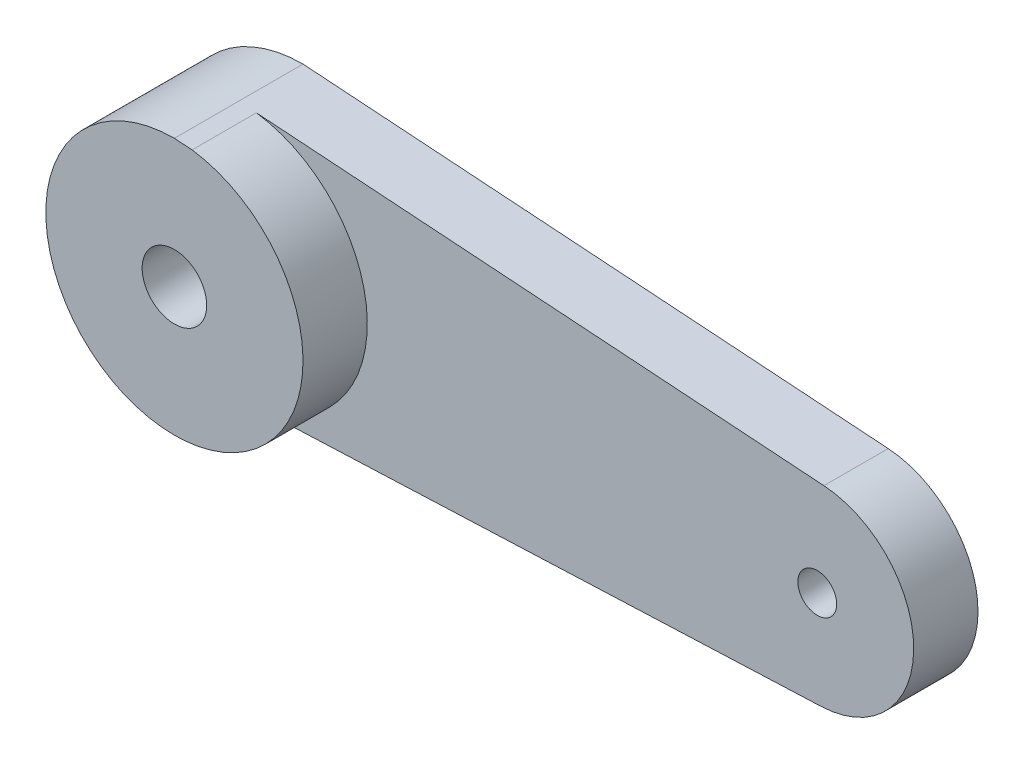
ISO-10303-21;
HEADER;
FILE_DESCRIPTION(('STEP AP214'),'2;1');
FILE_NAME('part.step','',(''),(''),'','','');
FILE_SCHEMA(('AUTOMOTIVE_DESIGN { 1 0 10303 214 1 1 1 1 }'));
ENDSEC;
DATA;
#1=APPLICATION_CONTEXT('core data for automotive mechanical design processes');
#2=APPLICATION_PROTOCOL_DEFINITION('international standard','automotive_design',2000,#1);
#3=PRODUCT_CONTEXT('',#1,'mechanical');
#4=PRODUCT('Part','Part','',(#3));
#5=PRODUCT_RELATED_PRODUCT_CATEGORY('part','',(#4));
#6=PRODUCT_DEFINITION_FORMATION('','',#4);
#7=PRODUCT_DEFINITION_CONTEXT('part definition',#1,'design');
#8=PRODUCT_DEFINITION('design','',#6,#7);
#9=PRODUCT_DEFINITION_SHAPE('','',#8);
#10=(LENGTH_UNIT() NAMED_UNIT(*) SI_UNIT(.MILLI.,.METRE.));
#11=(NAMED_UNIT(*) PLANE_ANGLE_UNIT() SI_UNIT($,.RADIAN.));
#12=(NAMED_UNIT(*) SI_UNIT($,.STERADIAN.) SOLID_ANGLE_UNIT());
#13=UNCERTAINTY_MEASURE_WITH_UNIT(LENGTH_MEASURE(1.E-05),#10,'distance_accuracy_value','');
#14=(GEOMETRIC_REPRESENTATION_CONTEXT(3) GLOBAL_UNCERTAINTY_ASSIGNED_CONTEXT((#13)) GLOBAL_UNIT_ASSIGNED_CONTEXT((#10,
#11,#12)) REPRESENTATION_CONTEXT('',''));
#15=CARTESIAN_POINT('',(0.,0.,0.));
#16=DIRECTION('',(0.,0.,1.));
#17=DIRECTION('',(1.,0.,0.));
#18=AXIS2_PLACEMENT_3D('',#15,#16,#17);
#19=CARTESIAN_POINT('',(0.686952853013244,9.95258475724918,10.));
#20=DIRECTION('',(0.0688587269348014,0.997626420923643,0.));
#21=DIRECTION('',(-0.997626420923643,0.0688587269348014,0.));
#22=AXIS2_PLACEMENT_3D('',#19,#20,#21);
#23=PLANE('',#22);
#24=DIRECTION('',(0.997626420923644,-0.0688587269348014,0.));
#25=VECTOR('',#24,1.);
#26=CARTESIAN_POINT('',(0.686952853013244,9.95258475724918,0.));
#27=LINE('',#26,#25);
#28=CARTESIAN_POINT('',(0.,10.,0.));
#29=VERTEX_POINT('',#28);
#30=CARTESIAN_POINT('',(45.5121199289753,6.85863708830833,0.));
#31=VERTEX_POINT('',#30);
#32=EDGE_CURVE('E113',#29,#31,#27,.T.);
#33=ORIENTED_EDGE('',*,*,#32,.F.);
#34=DIRECTION('',(0.,0.,-1.));
#35=VECTOR('',#34,1.);
#36=CARTESIAN_POINT('',(0.,10.,10.));
#37=LINE('',#36,#35);
#38=CARTESIAN_POINT('',(0.,10.,10.));
#39=VERTEX_POINT('',#38);
#40=EDGE_CURVE('E11',#39,#29,#37,.T.);
#41=ORIENTED_EDGE('',*,*,#40,.F.);
#42=DIRECTION('',(0.997626420923644,-0.0688587269348014,0.));
#43=VECTOR('',#42,1.);
#44=CARTESIAN_POINT('',(0.686952853013244,9.95258475724918,10.));
#45=LINE('',#44,#43);
#46=CARTESIAN_POINT('',(1.37390570602649,9.90516951449837,10.));
#47=VERTEX_POINT('',#46);
#48=EDGE_CURVE('E122',#39,#47,#45,.T.);
#49=ORIENTED_EDGE('',*,*,#48,.T.);
#50=DIRECTION('',(0.,0.,-1.));
#51=VECTOR('',#50,1.);
#52=CARTESIAN_POINT('',(1.37390570602649,9.90516951449837,10.));
#53=LINE('',#52,#51);
#54=CARTESIAN_POINT('',(1.37390570602649,9.90516951449837,5.));
#55=VERTEX_POINT('',#54);
#56=EDGE_CURVE('E137',#47,#55,#53,.T.);
#57=ORIENTED_EDGE('',*,*,#56,.T.);
#58=DIRECTION('',(0.997626420923644,-0.0688587269348014,0.));
#59=VECTOR('',#58,1.);
#60=CARTESIAN_POINT('',(0.686952853013244,9.95258475724918,5.));
#61=LINE('',#60,#59);
#62=CARTESIAN_POINT('',(45.5121199289753,6.85863708830833,5.));
#63=VERTEX_POINT('',#62);
#64=EDGE_CURVE('E98',#55,#63,#61,.T.);
#65=ORIENTED_EDGE('',*,*,#64,.T.);
#66=DIRECTION('',(0.,0.,-1.));
#67=VECTOR('',#66,1.);
#68=CARTESIAN_POINT('',(45.5121199289753,6.85863708830833,5.));
#69=LINE('',#68,#67);
#70=EDGE_CURVE('E94',#63,#31,#69,.T.);
#71=ORIENTED_EDGE('',*,*,#70,.T.);
#72=EDGE_LOOP('',(#33,#41,#49,#57,#65,#71));
#73=FACE_BOUND('',#72,.T.);
#74=ADVANCED_FACE('F35',(#73),#23,.T.);
#75=CARTESIAN_POINT('',(0.,0.,10.));
#76=DIRECTION('',(0.,0.,-1.));
#77=DIRECTION('',(-1.,0.,0.));
#78=AXIS2_PLACEMENT_3D('',#75,#76,#77);
#79=CYLINDRICAL_SURFACE('',#78,10.);
#80=CARTESIAN_POINT('',(0.,0.,0.));
#81=DIRECTION('',(0.,0.,1.));
#82=DIRECTION('',(1.,0.,0.));
#83=AXIS2_PLACEMENT_3D('',#80,#81,#82);
#84=CIRCLE('',#83,10.);
#85=CARTESIAN_POINT('',(0.,-10.,0.));
#86=VERTEX_POINT('',#85);
#87=EDGE_CURVE('E133',#29,#86,#84,.T.);
#88=ORIENTED_EDGE('',*,*,#87,.T.);
#89=DIRECTION('',(0.,0.,-1.));
#90=VECTOR('',#89,1.);
#91=CARTESIAN_POINT('',(0.,-10.,10.));
#92=LINE('',#91,#90);
#93=CARTESIAN_POINT('',(0.,-10.,10.));
#94=VERTEX_POINT('',#93);
#95=EDGE_CURVE('E43',#94,#86,#92,.T.);
#96=ORIENTED_EDGE('',*,*,#95,.F.);
#97=CARTESIAN_POINT('',(0.,0.,10.));
#98=DIRECTION('',(0.,0.,1.));
#99=DIRECTION('',(1.,0.,0.));
#100=AXIS2_PLACEMENT_3D('',#97,#98,#99);
#101=CIRCLE('',#100,10.);
#102=EDGE_CURVE('E125',#39,#94,#101,.T.);
#103=ORIENTED_EDGE('',*,*,#102,.F.);
#104=ORIENTED_EDGE('',*,*,#40,.T.);
#105=EDGE_LOOP('',(#88,#96,#103,#104));
#106=FACE_BOUND('',#105,.T.);
#107=ADVANCED_FACE('F143',(#106),#79,.T.);
#108=CARTESIAN_POINT('',(0.414871138524848,-9.98275846679519,10.));
#109=DIRECTION('',(-0.041522925239939,0.999137551430992,0.));
#110=DIRECTION('',(-0.999137551430992,-0.041522925239939,0.));
#111=AXIS2_PLACEMENT_3D('',#108,#109,#110);
#112=PLANE('',#111);
#113=DIRECTION('',(0.999137551430992,0.041522925239939,0.));
#114=VECTOR('',#113,1.);
#115=CARTESIAN_POINT('',(0.414871138524848,-9.98275846679519,0.));
#116=LINE('',#115,#114);
#117=CARTESIAN_POINT('',(45.3071014162638,-8.11709270435144,0.));
#118=VERTEX_POINT('',#117);
#119=EDGE_CURVE('E108',#86,#118,#116,.T.);
#120=ORIENTED_EDGE('',*,*,#119,.T.);
#121=DIRECTION('',(0.,0.,-1.));
#122=VECTOR('',#121,1.);
#123=CARTESIAN_POINT('',(45.3071014162638,-8.11709270435144,5.));
#124=LINE('',#123,#122);
#125=CARTESIAN_POINT('',(45.3071014162638,-8.11709270435144,5.));
#126=VERTEX_POINT('',#125);
#127=EDGE_CURVE('E92',#126,#118,#124,.T.);
#128=ORIENTED_EDGE('',*,*,#127,.F.);
#129=DIRECTION('',(0.999137551430992,0.041522925239939,0.));
#130=VECTOR('',#129,1.);
#131=CARTESIAN_POINT('',(0.414871138524848,-9.98275846679519,5.));
#132=LINE('',#131,#130);
#133=CARTESIAN_POINT('',(0.829742277049664,-9.96551693359037,5.));
#134=VERTEX_POINT('',#133);
#135=EDGE_CURVE('E99',#134,#126,#132,.T.);
#136=ORIENTED_EDGE('',*,*,#135,.F.);
#137=DIRECTION('',(0.,0.,-1.));
#138=VECTOR('',#137,1.);
#139=CARTESIAN_POINT('',(0.829742277049664,-9.96551693359037,10.));
#140=LINE('',#139,#138);
#141=CARTESIAN_POINT('',(0.829742277049664,-9.96551693359037,10.));
#142=VERTEX_POINT('',#141);
#143=EDGE_CURVE('E50',#142,#134,#140,.T.);
#144=ORIENTED_EDGE('',*,*,#143,.F.);
#145=DIRECTION('',(0.999137551430992,0.041522925239939,0.));
#146=VECTOR('',#145,1.);
#147=CARTESIAN_POINT('',(0.414871138524848,-9.98275846679519,10.));
#148=LINE('',#147,#146);
#149=EDGE_CURVE('E128',#94,#142,#148,.T.);
#150=ORIENTED_EDGE('',*,*,#149,.F.);
#151=ORIENTED_EDGE('',*,*,#95,.T.);
#152=EDGE_LOOP('',(#120,#128,#136,#144,#150,#151));
#153=FACE_BOUND('',#152,.T.);
#154=ADVANCED_FACE('F106',(#153),#112,.F.);
#155=CARTESIAN_POINT('',(0.,0.,10.));
#156=DIRECTION('',(0.,0.,-1.));
#157=DIRECTION('',(-1.,0.,0.));
#158=AXIS2_PLACEMENT_3D('',#155,#156,#157);
#159=CYLINDRICAL_SURFACE('',#158,2.51);
#160=CARTESIAN_POINT('',(0.,0.,10.));
#161=DIRECTION('',(0.,0.,1.));
#162=DIRECTION('',(1.,0.,0.));
#163=AXIS2_PLACEMENT_3D('',#160,#161,#162);
#164=CIRCLE('',#163,2.51);
#165=CARTESIAN_POINT('',(2.51,0.,10.));
#166=VERTEX_POINT('',#165);
#167=EDGE_CURVE('E119',#166,#166,#164,.T.);
#168=ORIENTED_EDGE('',*,*,#167,.T.);
#169=EDGE_LOOP('',(#168));
#170=FACE_BOUND('',#169,.T.);
#171=CARTESIAN_POINT('',(0.,0.,0.));
#172=DIRECTION('',(0.,0.,1.));
#173=DIRECTION('',(1.,0.,0.));
#174=AXIS2_PLACEMENT_3D('',#171,#172,#173);
#175=CIRCLE('',#174,2.51);
#176=CARTESIAN_POINT('',(2.51,0.,0.));
#177=VERTEX_POINT('',#176);
#178=EDGE_CURVE('E110',#177,#177,#175,.T.);
#179=ORIENTED_EDGE('',*,*,#178,.F.);
#180=EDGE_LOOP('',(#179));
#181=FACE_BOUND('',#180,.T.);
#182=ADVANCED_FACE('F37',(#170,#181),#159,.F.);
#183=ORIENTED_EDGE('',*,*,#143,.T.);
#184=CARTESIAN_POINT('',(0.,0.,5.));
#185=DIRECTION('',(0.,0.,1.));
#186=DIRECTION('',(1.,0.,0.));
#187=AXIS2_PLACEMENT_3D('',#184,#185,#186);
#188=CIRCLE('',#187,10.);
#189=EDGE_CURVE('E55',#134,#55,#188,.T.);
#190=ORIENTED_EDGE('',*,*,#189,.T.);
#191=ORIENTED_EDGE('',*,*,#56,.F.);
#192=EDGE_CURVE('E129',#142,#47,#101,.T.);
#193=ORIENTED_EDGE('',*,*,#192,.F.);
#194=EDGE_LOOP('',(#183,#190,#191,#193));
#195=FACE_BOUND('',#194,.T.);
#196=ADVANCED_FACE('F171',(#195),#79,.T.);
#197=CARTESIAN_POINT('',(0.,0.,10.));
#198=DIRECTION('',(0.,0.,1.));
#199=DIRECTION('',(1.,0.,0.));
#200=AXIS2_PLACEMENT_3D('',#197,#198,#199);
#201=PLANE('',#200);
#202=ORIENTED_EDGE('',*,*,#167,.F.);
#203=EDGE_LOOP('',(#202));
#204=FACE_BOUND('',#203,.T.);
#205=ORIENTED_EDGE('',*,*,#48,.F.);
#206=ORIENTED_EDGE('',*,*,#102,.T.);
#207=ORIENTED_EDGE('',*,*,#149,.T.);
#208=ORIENTED_EDGE('',*,*,#192,.T.);
#209=EDGE_LOOP('',(#205,#206,#207,#208));
#210=FACE_BOUND('',#209,.T.);
#211=ADVANCED_FACE('F176',(#204,#210),#201,.T.);
#212=CARTESIAN_POINT('',(0.,0.,0.));
#213=DIRECTION('',(0.,0.,1.));
#214=DIRECTION('',(1.,0.,0.));
#215=AXIS2_PLACEMENT_3D('',#212,#213,#214);
#216=PLANE('',#215);
#217=ORIENTED_EDGE('',*,*,#178,.T.);
#218=EDGE_LOOP('',(#217));
#219=FACE_BOUND('',#218,.T.);
#220=ORIENTED_EDGE('',*,*,#32,.T.);
#221=CARTESIAN_POINT('',(44.9956794769643,-0.623561068618998,0.));
#222=DIRECTION('',(0.,0.,1.));
#223=DIRECTION('',(1.,0.,0.));
#224=AXIS2_PLACEMENT_3D('',#221,#222,#223);
#225=CIRCLE('',#224,7.5);
#226=EDGE_CURVE('E149',#118,#31,#225,.T.);
#227=ORIENTED_EDGE('',*,*,#226,.F.);
#228=ORIENTED_EDGE('',*,*,#119,.F.);
#229=ORIENTED_EDGE('',*,*,#87,.F.);
#230=EDGE_LOOP('',(#220,#227,#228,#229));
#231=FACE_BOUND('',#230,.T.);
#232=CARTESIAN_POINT('',(44.9956794769643,-0.623561068618998,0.));
#233=DIRECTION('',(0.,0.,1.));
#234=DIRECTION('',(1.,0.,0.));
#235=AXIS2_PLACEMENT_3D('',#232,#233,#234);
#236=CIRCLE('',#235,1.51);
#237=CARTESIAN_POINT('',(46.5056794769643,-0.623561068618998,0.));
#238=VERTEX_POINT('',#237);
#239=EDGE_CURVE('E104',#238,#238,#236,.T.);
#240=ORIENTED_EDGE('',*,*,#239,.T.);
#241=EDGE_LOOP('',(#240));
#242=FACE_BOUND('',#241,.T.);
#243=ADVANCED_FACE('F146',(#219,#231,#242),#216,.F.);
#244=CARTESIAN_POINT('',(44.9956794769643,-0.623561068618998,5.));
#245=DIRECTION('',(0.,0.,-1.));
#246=DIRECTION('',(-1.,0.,0.));
#247=AXIS2_PLACEMENT_3D('',#244,#245,#246);
#248=CYLINDRICAL_SURFACE('',#247,7.5);
#249=ORIENTED_EDGE('',*,*,#226,.T.);
#250=ORIENTED_EDGE('',*,*,#70,.F.);
#251=CARTESIAN_POINT('',(44.9956794769643,-0.623561068618998,5.));
#252=DIRECTION('',(0.,0.,1.));
#253=DIRECTION('',(1.,0.,0.));
#254=AXIS2_PLACEMENT_3D('',#251,#252,#253);
#255=CIRCLE('',#254,7.5);
#256=EDGE_CURVE('E87',#126,#63,#255,.T.);
#257=ORIENTED_EDGE('',*,*,#256,.F.);
#258=ORIENTED_EDGE('',*,*,#127,.T.);
#259=EDGE_LOOP('',(#249,#250,#257,#258));
#260=FACE_BOUND('',#259,.T.);
#261=ADVANCED_FACE('F90',(#260),#248,.T.);
#262=CARTESIAN_POINT('',(44.9956794769643,-0.623561068618998,5.));
#263=DIRECTION('',(0.,0.,-1.));
#264=DIRECTION('',(-1.,0.,0.));
#265=AXIS2_PLACEMENT_3D('',#262,#263,#264);
#266=CYLINDRICAL_SURFACE('',#265,1.51);
#267=CARTESIAN_POINT('',(44.9956794769643,-0.623561068618998,5.));
#268=DIRECTION('',(0.,0.,1.));
#269=DIRECTION('',(1.,0.,0.));
#270=AXIS2_PLACEMENT_3D('',#267,#268,#269);
#271=CIRCLE('',#270,1.51);
#272=CARTESIAN_POINT('',(46.5056794769643,-0.623561068618998,5.));
#273=VERTEX_POINT('',#272);
#274=EDGE_CURVE('E115',#273,#273,#271,.T.);
#275=ORIENTED_EDGE('',*,*,#274,.T.);
#276=EDGE_LOOP('',(#275));
#277=FACE_BOUND('',#276,.T.);
#278=ORIENTED_EDGE('',*,*,#239,.F.);
#279=EDGE_LOOP('',(#278));
#280=FACE_BOUND('',#279,.T.);
#281=ADVANCED_FACE('F158',(#277,#280),#266,.F.);
#282=CARTESIAN_POINT('',(0.,0.,5.));
#283=DIRECTION('',(0.,0.,1.));
#284=DIRECTION('',(1.,0.,0.));
#285=AXIS2_PLACEMENT_3D('',#282,#283,#284);
#286=PLANE('',#285);
#287=ORIENTED_EDGE('',*,*,#135,.T.);
#288=ORIENTED_EDGE('',*,*,#256,.T.);
#289=ORIENTED_EDGE('',*,*,#64,.F.);
#290=ORIENTED_EDGE('',*,*,#189,.F.);
#291=EDGE_LOOP('',(#287,#288,#289,#290));
#292=FACE_BOUND('',#291,.T.);
#293=ORIENTED_EDGE('',*,*,#274,.F.);
#294=EDGE_LOOP('',(#293));
#295=FACE_BOUND('',#294,.T.);
#296=ADVANCED_FACE('F101',(#292,#295),#286,.T.);
#297=CLOSED_SHELL('',(#74,#107,#154,#182,#196,#211,#243,#261,#281,#296));
#298=MANIFOLD_SOLID_BREP('B2',#297);
#299=ADVANCED_BREP_SHAPE_REPRESENTATION('',(#18,#298),#14);
#300=SHAPE_DEFINITION_REPRESENTATION(#9,#299);
ENDSEC;
END-ISO-10303-21;
